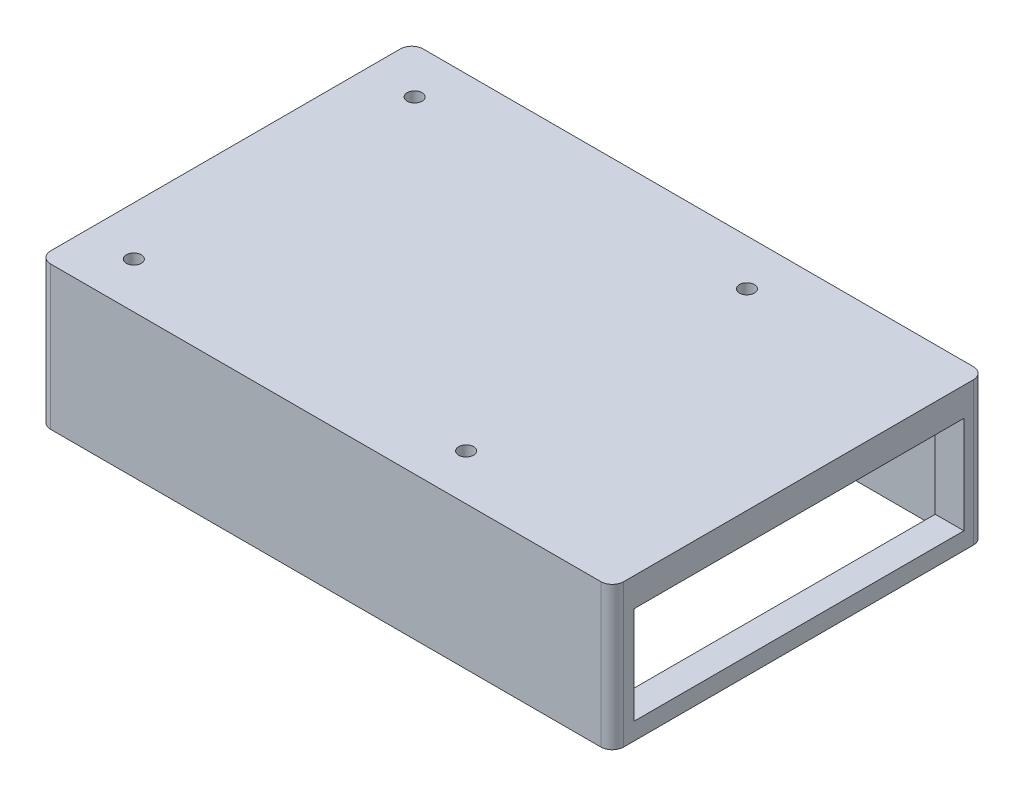
ISO-10303-21;
HEADER;
FILE_DESCRIPTION(('STEP AP214'),'2;1');
FILE_NAME('part.step','',(''),(''),'','','');
FILE_SCHEMA(('AUTOMOTIVE_DESIGN { 1 0 10303 214 1 1 1 1 }'));
ENDSEC;
DATA;
#1=APPLICATION_CONTEXT('core data for automotive mechanical design processes');
#2=APPLICATION_PROTOCOL_DEFINITION('international standard','automotive_design',2000,#1);
#3=PRODUCT_CONTEXT('',#1,'mechanical');
#4=PRODUCT('Part','Part','',(#3));
#5=PRODUCT_RELATED_PRODUCT_CATEGORY('part','',(#4));
#6=PRODUCT_DEFINITION_FORMATION('','',#4);
#7=PRODUCT_DEFINITION_CONTEXT('part definition',#1,'design');
#8=PRODUCT_DEFINITION('design','',#6,#7);
#9=PRODUCT_DEFINITION_SHAPE('','',#8);
#10=(LENGTH_UNIT() NAMED_UNIT(*) SI_UNIT(.MILLI.,.METRE.));
#11=(NAMED_UNIT(*) PLANE_ANGLE_UNIT() SI_UNIT($,.RADIAN.));
#12=(NAMED_UNIT(*) SI_UNIT($,.STERADIAN.) SOLID_ANGLE_UNIT());
#13=UNCERTAINTY_MEASURE_WITH_UNIT(LENGTH_MEASURE(1.E-05),#10,'distance_accuracy_value','');
#14=(GEOMETRIC_REPRESENTATION_CONTEXT(3) GLOBAL_UNCERTAINTY_ASSIGNED_CONTEXT((#13)) GLOBAL_UNIT_ASSIGNED_CONTEXT((#10,
#11,#12)) REPRESENTATION_CONTEXT('',''));
#15=CARTESIAN_POINT('',(0.,0.,0.));
#16=DIRECTION('',(0.,0.,1.));
#17=DIRECTION('',(1.,0.,0.));
#18=AXIS2_PLACEMENT_3D('',#15,#16,#17);
#19=CARTESIAN_POINT('',(48.,25.,-30.5));
#20=DIRECTION('',(0.,1.,0.));
#21=DIRECTION('',(0.,0.,1.));
#22=AXIS2_PLACEMENT_3D('',#19,#20,#21);
#23=CYLINDRICAL_SURFACE('',#22,2.);
#24=DIRECTION('',(0.,1.,0.));
#25=VECTOR('',#24,1.);
#26=CARTESIAN_POINT('',(50.,25.,-30.5));
#27=LINE('',#26,#25);
#28=CARTESIAN_POINT('',(50.,0.,-30.5));
#29=VERTEX_POINT('',#28);
#30=CARTESIAN_POINT('',(50.,25.,-30.5));
#31=VERTEX_POINT('',#30);
#32=EDGE_CURVE('E339',#29,#31,#27,.T.);
#33=ORIENTED_EDGE('',*,*,#32,.F.);
#34=CARTESIAN_POINT('',(48.,0.,-30.5));
#35=DIRECTION('',(0.,1.,0.));
#36=DIRECTION('',(0.,0.,1.));
#37=AXIS2_PLACEMENT_3D('',#34,#35,#36);
#38=CIRCLE('',#37,2.);
#39=CARTESIAN_POINT('',(48.,0.,-32.5));
#40=VERTEX_POINT('',#39);
#41=EDGE_CURVE('E345',#40,#29,#38,.F.);
#42=ORIENTED_EDGE('',*,*,#41,.F.);
#43=DIRECTION('',(0.,1.,0.));
#44=VECTOR('',#43,1.);
#45=CARTESIAN_POINT('',(48.,25.,-32.5));
#46=LINE('',#45,#44);
#47=CARTESIAN_POINT('',(48.,25.,-32.5));
#48=VERTEX_POINT('',#47);
#49=EDGE_CURVE('E342',#48,#40,#46,.F.);
#50=ORIENTED_EDGE('',*,*,#49,.F.);
#51=CARTESIAN_POINT('',(48.,25.,-30.5));
#52=DIRECTION('',(0.,1.,0.));
#53=DIRECTION('',(0.,0.,1.));
#54=AXIS2_PLACEMENT_3D('',#51,#52,#53);
#55=CIRCLE('',#54,2.);
#56=EDGE_CURVE('E347',#31,#48,#55,.T.);
#57=ORIENTED_EDGE('',*,*,#56,.F.);
#58=EDGE_LOOP('',(#33,#42,#50,#57));
#59=FACE_BOUND('',#58,.T.);
#60=ADVANCED_FACE('F40',(#59),#23,.T.);
#61=CARTESIAN_POINT('',(-48.,25.,-30.5));
#62=DIRECTION('',(0.,-1.,0.));
#63=DIRECTION('',(0.,0.,-1.));
#64=AXIS2_PLACEMENT_3D('',#61,#62,#63);
#65=CYLINDRICAL_SURFACE('',#64,2.);
#66=DIRECTION('',(0.,1.,0.));
#67=VECTOR('',#66,1.);
#68=CARTESIAN_POINT('',(-48.,25.,-32.5));
#69=LINE('',#68,#67);
#70=CARTESIAN_POINT('',(-48.,0.,-32.5));
#71=VERTEX_POINT('',#70);
#72=CARTESIAN_POINT('',(-48.,25.,-32.5));
#73=VERTEX_POINT('',#72);
#74=EDGE_CURVE('E329',#71,#73,#69,.T.);
#75=ORIENTED_EDGE('',*,*,#74,.F.);
#76=CARTESIAN_POINT('',(-48.,0.,-30.5));
#77=DIRECTION('',(0.,1.,0.));
#78=DIRECTION('',(0.,0.,1.));
#79=AXIS2_PLACEMENT_3D('',#76,#77,#78);
#80=CIRCLE('',#79,2.);
#81=CARTESIAN_POINT('',(-50.,0.,-30.5));
#82=VERTEX_POINT('',#81);
#83=EDGE_CURVE('E335',#82,#71,#80,.F.);
#84=ORIENTED_EDGE('',*,*,#83,.F.);
#85=DIRECTION('',(0.,1.,0.));
#86=VECTOR('',#85,1.);
#87=CARTESIAN_POINT('',(-50.,25.,-30.5));
#88=LINE('',#87,#86);
#89=CARTESIAN_POINT('',(-50.,25.,-30.5));
#90=VERTEX_POINT('',#89);
#91=EDGE_CURVE('E332',#90,#82,#88,.F.);
#92=ORIENTED_EDGE('',*,*,#91,.F.);
#93=CARTESIAN_POINT('',(-48.,25.,-30.5));
#94=DIRECTION('',(0.,1.,0.));
#95=DIRECTION('',(0.,0.,1.));
#96=AXIS2_PLACEMENT_3D('',#93,#94,#95);
#97=CIRCLE('',#96,2.);
#98=EDGE_CURVE('E337',#73,#90,#97,.T.);
#99=ORIENTED_EDGE('',*,*,#98,.F.);
#100=EDGE_LOOP('',(#75,#84,#92,#99));
#101=FACE_BOUND('',#100,.T.);
#102=ADVANCED_FACE('F376',(#101),#65,.T.);
#103=CARTESIAN_POINT('',(-48.,25.,30.5));
#104=DIRECTION('',(0.,1.,0.));
#105=DIRECTION('',(0.,0.,1.));
#106=AXIS2_PLACEMENT_3D('',#103,#104,#105);
#107=CYLINDRICAL_SURFACE('',#106,2.);
#108=DIRECTION('',(0.,1.,0.));
#109=VECTOR('',#108,1.);
#110=CARTESIAN_POINT('',(-50.,25.,30.5));
#111=LINE('',#110,#109);
#112=CARTESIAN_POINT('',(-50.,0.,30.5));
#113=VERTEX_POINT('',#112);
#114=CARTESIAN_POINT('',(-50.,25.,30.5));
#115=VERTEX_POINT('',#114);
#116=EDGE_CURVE('E318',#113,#115,#111,.T.);
#117=ORIENTED_EDGE('',*,*,#116,.F.);
#118=CARTESIAN_POINT('',(-48.,0.,30.5));
#119=DIRECTION('',(0.,1.,0.));
#120=DIRECTION('',(0.,0.,1.));
#121=AXIS2_PLACEMENT_3D('',#118,#119,#120);
#122=CIRCLE('',#121,2.);
#123=CARTESIAN_POINT('',(-48.,0.,32.5));
#124=VERTEX_POINT('',#123);
#125=EDGE_CURVE('E324',#124,#113,#122,.F.);
#126=ORIENTED_EDGE('',*,*,#125,.F.);
#127=DIRECTION('',(0.,1.,0.));
#128=VECTOR('',#127,1.);
#129=CARTESIAN_POINT('',(-48.,25.,32.5));
#130=LINE('',#129,#128);
#131=CARTESIAN_POINT('',(-48.,25.,32.5));
#132=VERTEX_POINT('',#131);
#133=EDGE_CURVE('E321',#132,#124,#130,.F.);
#134=ORIENTED_EDGE('',*,*,#133,.F.);
#135=CARTESIAN_POINT('',(-48.,25.,30.5));
#136=DIRECTION('',(0.,1.,0.));
#137=DIRECTION('',(0.,0.,1.));
#138=AXIS2_PLACEMENT_3D('',#135,#136,#137);
#139=CIRCLE('',#138,2.);
#140=EDGE_CURVE('E327',#115,#132,#139,.T.);
#141=ORIENTED_EDGE('',*,*,#140,.F.);
#142=EDGE_LOOP('',(#117,#126,#134,#141));
#143=FACE_BOUND('',#142,.T.);
#144=ADVANCED_FACE('F381',(#143),#107,.T.);
#145=CARTESIAN_POINT('',(48.,25.,30.5));
#146=DIRECTION('',(0.,-1.,0.));
#147=DIRECTION('',(0.,0.,-1.));
#148=AXIS2_PLACEMENT_3D('',#145,#146,#147);
#149=CYLINDRICAL_SURFACE('',#148,2.);
#150=DIRECTION('',(0.,1.,0.));
#151=VECTOR('',#150,1.);
#152=CARTESIAN_POINT('',(48.,25.,32.5));
#153=LINE('',#152,#151);
#154=CARTESIAN_POINT('',(48.,0.,32.5));
#155=VERTEX_POINT('',#154);
#156=CARTESIAN_POINT('',(48.,25.,32.5));
#157=VERTEX_POINT('',#156);
#158=EDGE_CURVE('E299',#155,#157,#153,.T.);
#159=ORIENTED_EDGE('',*,*,#158,.F.);
#160=CARTESIAN_POINT('',(48.,0.,30.5));
#161=DIRECTION('',(0.,1.,0.));
#162=DIRECTION('',(0.,0.,1.));
#163=AXIS2_PLACEMENT_3D('',#160,#161,#162);
#164=CIRCLE('',#163,2.);
#165=CARTESIAN_POINT('',(50.,0.,30.5));
#166=VERTEX_POINT('',#165);
#167=EDGE_CURVE('E312',#166,#155,#164,.F.);
#168=ORIENTED_EDGE('',*,*,#167,.F.);
#169=DIRECTION('',(0.,1.,0.));
#170=VECTOR('',#169,1.);
#171=CARTESIAN_POINT('',(50.,25.,30.5));
#172=LINE('',#171,#170);
#173=CARTESIAN_POINT('',(50.,25.,30.5));
#174=VERTEX_POINT('',#173);
#175=EDGE_CURVE('E309',#174,#166,#172,.F.);
#176=ORIENTED_EDGE('',*,*,#175,.F.);
#177=CARTESIAN_POINT('',(48.,25.,30.5));
#178=DIRECTION('',(0.,1.,0.));
#179=DIRECTION('',(0.,0.,1.));
#180=AXIS2_PLACEMENT_3D('',#177,#178,#179);
#181=CIRCLE('',#180,2.);
#182=EDGE_CURVE('E315',#157,#174,#181,.T.);
#183=ORIENTED_EDGE('',*,*,#182,.F.);
#184=EDGE_LOOP('',(#159,#168,#176,#183));
#185=FACE_BOUND('',#184,.T.);
#186=ADVANCED_FACE('F395',(#185),#149,.T.);
#187=CARTESIAN_POINT('',(0.,0.,0.));
#188=DIRECTION('',(0.,1.,0.));
#189=DIRECTION('',(0.,0.,1.));
#190=AXIS2_PLACEMENT_3D('',#187,#188,#189);
#191=PLANE('',#190);
#192=DIRECTION('',(1.,0.,0.));
#193=VECTOR('',#192,1.);
#194=CARTESIAN_POINT('',(-50.,0.,-32.5));
#195=LINE('',#194,#193);
#196=EDGE_CURVE('E292',#71,#40,#195,.T.);
#197=ORIENTED_EDGE('',*,*,#196,.T.);
#198=ORIENTED_EDGE('',*,*,#41,.T.);
#199=DIRECTION('',(0.,0.,1.));
#200=VECTOR('',#199,1.);
#201=CARTESIAN_POINT('',(50.,0.,-32.5));
#202=LINE('',#201,#200);
#203=EDGE_CURVE('E303',#29,#166,#202,.T.);
#204=ORIENTED_EDGE('',*,*,#203,.T.);
#205=ORIENTED_EDGE('',*,*,#167,.T.);
#206=DIRECTION('',(1.,0.,0.));
#207=VECTOR('',#206,1.);
#208=CARTESIAN_POINT('',(-50.,0.,32.5));
#209=LINE('',#208,#207);
#210=EDGE_CURVE('E301',#124,#155,#209,.T.);
#211=ORIENTED_EDGE('',*,*,#210,.F.);
#212=ORIENTED_EDGE('',*,*,#125,.T.);
#213=DIRECTION('',(0.,0.,1.));
#214=VECTOR('',#213,1.);
#215=CARTESIAN_POINT('',(-50.,0.,-32.5));
#216=LINE('',#215,#214);
#217=EDGE_CURVE('E288',#82,#113,#216,.T.);
#218=ORIENTED_EDGE('',*,*,#217,.F.);
#219=ORIENTED_EDGE('',*,*,#83,.T.);
#220=EDGE_LOOP('',(#197,#198,#204,#205,#211,#212,#218,#219));
#221=FACE_BOUND('',#220,.T.);
#222=DIRECTION('',(1.,0.,0.));
#223=VECTOR('',#222,1.);
#224=CARTESIAN_POINT('',(-45.,0.,30.));
#225=LINE('',#224,#223);
#226=CARTESIAN_POINT('',(-45.,0.,30.));
#227=VERTEX_POINT('',#226);
#228=CARTESIAN_POINT('',(45.,0.,30.));
#229=VERTEX_POINT('',#228);
#230=EDGE_CURVE('E253',#227,#229,#225,.T.);
#231=ORIENTED_EDGE('',*,*,#230,.T.);
#232=DIRECTION('',(0.,0.,-1.));
#233=VECTOR('',#232,1.);
#234=CARTESIAN_POINT('',(45.,0.,30.));
#235=LINE('',#234,#233);
#236=CARTESIAN_POINT('',(45.,0.,-30.));
#237=VERTEX_POINT('',#236);
#238=EDGE_CURVE('E271',#229,#237,#235,.T.);
#239=ORIENTED_EDGE('',*,*,#238,.T.);
#240=DIRECTION('',(1.,0.,0.));
#241=VECTOR('',#240,1.);
#242=CARTESIAN_POINT('',(-45.,0.,-30.));
#243=LINE('',#242,#241);
#244=CARTESIAN_POINT('',(-45.,0.,-30.));
#245=VERTEX_POINT('',#244);
#246=EDGE_CURVE('E274',#245,#237,#243,.T.);
#247=ORIENTED_EDGE('',*,*,#246,.F.);
#248=DIRECTION('',(0.,0.,-1.));
#249=VECTOR('',#248,1.);
#250=CARTESIAN_POINT('',(-45.,0.,30.));
#251=LINE('',#250,#249);
#252=EDGE_CURVE('E258',#227,#245,#251,.T.);
#253=ORIENTED_EDGE('',*,*,#252,.F.);
#254=EDGE_LOOP('',(#231,#239,#247,#253));
#255=FACE_BOUND('',#254,.T.);
#256=ADVANCED_FACE('F390',(#221,#255),#191,.F.);
#257=CARTESIAN_POINT('',(-50.,25.,-32.5));
#258=DIRECTION('',(1.,0.,0.));
#259=DIRECTION('',(0.,0.,-1.));
#260=AXIS2_PLACEMENT_3D('',#257,#258,#259);
#261=PLANE('',#260);
#262=DIRECTION('',(0.,0.,1.));
#263=VECTOR('',#262,1.);
#264=CARTESIAN_POINT('',(-50.,25.,-32.5));
#265=LINE('',#264,#263);
#266=EDGE_CURVE('E289',#90,#115,#265,.T.);
#267=ORIENTED_EDGE('',*,*,#266,.F.);
#268=ORIENTED_EDGE('',*,*,#91,.T.);
#269=ORIENTED_EDGE('',*,*,#217,.T.);
#270=ORIENTED_EDGE('',*,*,#116,.T.);
#271=EDGE_LOOP('',(#267,#268,#269,#270));
#272=FACE_BOUND('',#271,.T.);
#273=ADVANCED_FACE('F407',(#272),#261,.F.);
#274=CARTESIAN_POINT('',(-50.,25.,32.5));
#275=DIRECTION('',(0.,0.,-1.));
#276=DIRECTION('',(-1.,0.,0.));
#277=AXIS2_PLACEMENT_3D('',#274,#275,#276);
#278=PLANE('',#277);
#279=DIRECTION('',(1.,0.,0.));
#280=VECTOR('',#279,1.);
#281=CARTESIAN_POINT('',(-50.,25.,32.5));
#282=LINE('',#281,#280);
#283=EDGE_CURVE('E291',#132,#157,#282,.T.);
#284=ORIENTED_EDGE('',*,*,#283,.F.);
#285=ORIENTED_EDGE('',*,*,#133,.T.);
#286=ORIENTED_EDGE('',*,*,#210,.T.);
#287=ORIENTED_EDGE('',*,*,#158,.T.);
#288=EDGE_LOOP('',(#284,#285,#286,#287));
#289=FACE_BOUND('',#288,.T.);
#290=ADVANCED_FACE('F399',(#289),#278,.F.);
#291=CARTESIAN_POINT('',(50.,25.,-32.5));
#292=DIRECTION('',(1.,0.,0.));
#293=DIRECTION('',(0.,0.,-1.));
#294=AXIS2_PLACEMENT_3D('',#291,#292,#293);
#295=PLANE('',#294);
#296=DIRECTION('',(0.,-1.,0.));
#297=VECTOR('',#296,1.);
#298=CARTESIAN_POINT('',(50.,20.,28.7137423599596));
#299=LINE('',#298,#297);
#300=CARTESIAN_POINT('',(50.,20.,28.7137423599596));
#301=VERTEX_POINT('',#300);
#302=CARTESIAN_POINT('',(50.,3.,28.7137423599596));
#303=VERTEX_POINT('',#302);
#304=EDGE_CURVE('E54',#301,#303,#299,.T.);
#305=ORIENTED_EDGE('',*,*,#304,.F.);
#306=DIRECTION('',(0.,0.,1.));
#307=VECTOR('',#306,1.);
#308=CARTESIAN_POINT('',(50.,20.,28.7137423599596));
#309=LINE('',#308,#307);
#310=CARTESIAN_POINT('',(50.,20.,-28.8609923207799));
#311=VERTEX_POINT('',#310);
#312=EDGE_CURVE('E194',#311,#301,#309,.T.);
#313=ORIENTED_EDGE('',*,*,#312,.F.);
#314=DIRECTION('',(0.,1.,0.));
#315=VECTOR('',#314,1.);
#316=CARTESIAN_POINT('',(50.,20.,-28.8609923207799));
#317=LINE('',#316,#315);
#318=CARTESIAN_POINT('',(50.,3.,-28.8609923207799));
#319=VERTEX_POINT('',#318);
#320=EDGE_CURVE('E178',#319,#311,#317,.T.);
#321=ORIENTED_EDGE('',*,*,#320,.F.);
#322=DIRECTION('',(0.,0.,-1.));
#323=VECTOR('',#322,1.);
#324=CARTESIAN_POINT('',(50.,3.,28.7137423599596));
#325=LINE('',#324,#323);
#326=EDGE_CURVE('E187',#303,#319,#325,.T.);
#327=ORIENTED_EDGE('',*,*,#326,.F.);
#328=EDGE_LOOP('',(#305,#313,#321,#327));
#329=FACE_BOUND('',#328,.T.);
#330=ORIENTED_EDGE('',*,*,#203,.F.);
#331=ORIENTED_EDGE('',*,*,#32,.T.);
#332=DIRECTION('',(0.,0.,1.));
#333=VECTOR('',#332,1.);
#334=CARTESIAN_POINT('',(50.,25.,-32.5));
#335=LINE('',#334,#333);
#336=EDGE_CURVE('E294',#31,#174,#335,.T.);
#337=ORIENTED_EDGE('',*,*,#336,.T.);
#338=ORIENTED_EDGE('',*,*,#175,.T.);
#339=EDGE_LOOP('',(#330,#331,#337,#338));
#340=FACE_BOUND('',#339,.T.);
#341=ADVANCED_FACE('F191',(#329,#340),#295,.T.);
#342=CARTESIAN_POINT('',(-50.,25.,-32.5));
#343=DIRECTION('',(0.,0.,-1.));
#344=DIRECTION('',(-1.,0.,0.));
#345=AXIS2_PLACEMENT_3D('',#342,#343,#344);
#346=PLANE('',#345);
#347=DIRECTION('',(0.,-1.,0.));
#348=VECTOR('',#347,1.);
#349=CARTESIAN_POINT('',(-2.00000000000002,22.,-32.5));
#350=LINE('',#349,#348);
#351=CARTESIAN_POINT('',(-2.00000000000002,22.,-32.5));
#352=VERTEX_POINT('',#351);
#353=CARTESIAN_POINT('',(-2.00000000000002,15.2793607625604,-32.5));
#354=VERTEX_POINT('',#353);
#355=EDGE_CURVE('E201',#352,#354,#350,.T.);
#356=ORIENTED_EDGE('',*,*,#355,.F.);
#357=DIRECTION('',(1.,0.,0.));
#358=VECTOR('',#357,1.);
#359=CARTESIAN_POINT('',(-2.00000000000002,22.,-32.5));
#360=LINE('',#359,#358);
#361=CARTESIAN_POINT('',(-39.,22.,-32.5));
#362=VERTEX_POINT('',#361);
#363=EDGE_CURVE('E211',#362,#352,#360,.T.);
#364=ORIENTED_EDGE('',*,*,#363,.F.);
#365=DIRECTION('',(0.,1.,0.));
#366=VECTOR('',#365,1.);
#367=CARTESIAN_POINT('',(-39.,22.,-32.5));
#368=LINE('',#367,#366);
#369=CARTESIAN_POINT('',(-39.,15.2793607625604,-32.5));
#370=VERTEX_POINT('',#369);
#371=EDGE_CURVE('E208',#370,#362,#368,.T.);
#372=ORIENTED_EDGE('',*,*,#371,.F.);
#373=DIRECTION('',(-1.,0.,0.));
#374=VECTOR('',#373,1.);
#375=CARTESIAN_POINT('',(-2.00000000000002,15.2793607625604,-32.5));
#376=LINE('',#375,#374);
#377=EDGE_CURVE('E205',#354,#370,#376,.T.);
#378=ORIENTED_EDGE('',*,*,#377,.F.);
#379=EDGE_LOOP('',(#356,#364,#372,#378));
#380=FACE_BOUND('',#379,.T.);
#381=DIRECTION('',(1.,0.,0.));
#382=VECTOR('',#381,1.);
#383=CARTESIAN_POINT('',(-50.,25.,-32.5));
#384=LINE('',#383,#382);
#385=EDGE_CURVE('E296',#73,#48,#384,.T.);
#386=ORIENTED_EDGE('',*,*,#385,.T.);
#387=ORIENTED_EDGE('',*,*,#49,.T.);
#388=ORIENTED_EDGE('',*,*,#196,.F.);
#389=ORIENTED_EDGE('',*,*,#74,.T.);
#390=EDGE_LOOP('',(#386,#387,#388,#389));
#391=FACE_BOUND('',#390,.T.);
#392=ADVANCED_FACE('F412',(#380,#391),#346,.T.);
#393=CARTESIAN_POINT('',(0.,25.,0.));
#394=DIRECTION('',(0.,1.,0.));
#395=DIRECTION('',(0.,0.,1.));
#396=AXIS2_PLACEMENT_3D('',#393,#394,#395);
#397=PLANE('',#396);
#398=CARTESIAN_POINT('',(16.5,25.,24.5));
#399=DIRECTION('',(0.,1.,0.));
#400=DIRECTION('',(0.,0.,1.));
#401=AXIS2_PLACEMENT_3D('',#398,#399,#400);
#402=CIRCLE('',#401,1.3);
#403=CARTESIAN_POINT('',(16.5,25.,25.8));
#404=VERTEX_POINT('',#403);
#405=EDGE_CURVE('E250',#404,#404,#402,.T.);
#406=ORIENTED_EDGE('',*,*,#405,.F.);
#407=EDGE_LOOP('',(#406));
#408=FACE_BOUND('',#407,.T.);
#409=CARTESIAN_POINT('',(16.5,25.,-24.5));
#410=DIRECTION('',(0.,1.,0.));
#411=DIRECTION('',(0.,0.,1.));
#412=AXIS2_PLACEMENT_3D('',#409,#410,#411);
#413=CIRCLE('',#412,1.3);
#414=CARTESIAN_POINT('',(16.5,25.,-23.2));
#415=VERTEX_POINT('',#414);
#416=EDGE_CURVE('E247',#415,#415,#413,.T.);
#417=ORIENTED_EDGE('',*,*,#416,.F.);
#418=EDGE_LOOP('',(#417));
#419=FACE_BOUND('',#418,.T.);
#420=CARTESIAN_POINT('',(-41.5,25.,-24.5));
#421=DIRECTION('',(0.,1.,0.));
#422=DIRECTION('',(0.,0.,1.));
#423=AXIS2_PLACEMENT_3D('',#420,#421,#422);
#424=CIRCLE('',#423,1.3);
#425=CARTESIAN_POINT('',(-41.5,25.,-23.2));
#426=VERTEX_POINT('',#425);
#427=EDGE_CURVE('E244',#426,#426,#424,.T.);
#428=ORIENTED_EDGE('',*,*,#427,.F.);
#429=EDGE_LOOP('',(#428));
#430=FACE_BOUND('',#429,.T.);
#431=CARTESIAN_POINT('',(-41.5,25.,24.5));
#432=DIRECTION('',(0.,1.,0.));
#433=DIRECTION('',(0.,0.,1.));
#434=AXIS2_PLACEMENT_3D('',#431,#432,#433);
#435=CIRCLE('',#434,1.3);
#436=CARTESIAN_POINT('',(-41.5,25.,25.8));
#437=VERTEX_POINT('',#436);
#438=EDGE_CURVE('E241',#437,#437,#435,.T.);
#439=ORIENTED_EDGE('',*,*,#438,.F.);
#440=EDGE_LOOP('',(#439));
#441=FACE_BOUND('',#440,.T.);
#442=ORIENTED_EDGE('',*,*,#336,.F.);
#443=ORIENTED_EDGE('',*,*,#56,.T.);
#444=ORIENTED_EDGE('',*,*,#385,.F.);
#445=ORIENTED_EDGE('',*,*,#98,.T.);
#446=ORIENTED_EDGE('',*,*,#266,.T.);
#447=ORIENTED_EDGE('',*,*,#140,.T.);
#448=ORIENTED_EDGE('',*,*,#283,.T.);
#449=ORIENTED_EDGE('',*,*,#182,.T.);
#450=EDGE_LOOP('',(#442,#443,#444,#445,#446,#447,#448,#449));
#451=FACE_BOUND('',#450,.T.);
#452=ADVANCED_FACE('F415',(#408,#419,#430,#441,#451),#397,.T.);
#453=CARTESIAN_POINT('',(-45.,22.,30.));
#454=DIRECTION('',(0.,0.,-1.));
#455=DIRECTION('',(-1.,0.,0.));
#456=AXIS2_PLACEMENT_3D('',#453,#454,#455);
#457=PLANE('',#456);
#458=ORIENTED_EDGE('',*,*,#230,.F.);
#459=DIRECTION('',(0.,-1.,0.));
#460=VECTOR('',#459,1.);
#461=CARTESIAN_POINT('',(-45.,22.,30.));
#462=LINE('',#461,#460);
#463=CARTESIAN_POINT('',(-45.,22.,30.));
#464=VERTEX_POINT('',#463);
#465=EDGE_CURVE('E268',#464,#227,#462,.T.);
#466=ORIENTED_EDGE('',*,*,#465,.F.);
#467=DIRECTION('',(1.,0.,0.));
#468=VECTOR('',#467,1.);
#469=CARTESIAN_POINT('',(-45.,22.,30.));
#470=LINE('',#469,#468);
#471=CARTESIAN_POINT('',(45.,22.,30.));
#472=VERTEX_POINT('',#471);
#473=EDGE_CURVE('E254',#464,#472,#470,.T.);
#474=ORIENTED_EDGE('',*,*,#473,.T.);
#475=DIRECTION('',(0.,-1.,0.));
#476=VECTOR('',#475,1.);
#477=CARTESIAN_POINT('',(45.,22.,30.));
#478=LINE('',#477,#476);
#479=EDGE_CURVE('E285',#472,#229,#478,.T.);
#480=ORIENTED_EDGE('',*,*,#479,.T.);
#481=EDGE_LOOP('',(#458,#466,#474,#480));
#482=FACE_BOUND('',#481,.T.);
#483=ADVANCED_FACE('F417',(#482),#457,.T.);
#484=CARTESIAN_POINT('',(45.,22.,30.));
#485=DIRECTION('',(-1.,0.,0.));
#486=DIRECTION('',(0.,0.,1.));
#487=AXIS2_PLACEMENT_3D('',#484,#485,#486);
#488=PLANE('',#487);
#489=DIRECTION('',(0.,1.,0.));
#490=VECTOR('',#489,1.);
#491=CARTESIAN_POINT('',(45.,22.,28.7137423599596));
#492=LINE('',#491,#490);
#493=CARTESIAN_POINT('',(45.,3.,28.7137423599596));
#494=VERTEX_POINT('',#493);
#495=CARTESIAN_POINT('',(45.,20.,28.7137423599596));
#496=VERTEX_POINT('',#495);
#497=EDGE_CURVE('E11',#494,#496,#492,.T.);
#498=ORIENTED_EDGE('',*,*,#497,.F.);
#499=DIRECTION('',(0.,0.,1.));
#500=VECTOR('',#499,1.);
#501=CARTESIAN_POINT('',(45.,3.,30.));
#502=LINE('',#501,#500);
#503=CARTESIAN_POINT('',(45.,3.,-28.8609923207799));
#504=VERTEX_POINT('',#503);
#505=EDGE_CURVE('E352',#504,#494,#502,.T.);
#506=ORIENTED_EDGE('',*,*,#505,.F.);
#507=DIRECTION('',(0.,-1.,0.));
#508=VECTOR('',#507,1.);
#509=CARTESIAN_POINT('',(45.,22.,-28.8609923207799));
#510=LINE('',#509,#508);
#511=CARTESIAN_POINT('',(45.,20.,-28.8609923207799));
#512=VERTEX_POINT('',#511);
#513=EDGE_CURVE('E181',#512,#504,#510,.T.);
#514=ORIENTED_EDGE('',*,*,#513,.F.);
#515=DIRECTION('',(0.,0.,-1.));
#516=VECTOR('',#515,1.);
#517=CARTESIAN_POINT('',(45.,20.,30.));
#518=LINE('',#517,#516);
#519=EDGE_CURVE('E47',#496,#512,#518,.T.);
#520=ORIENTED_EDGE('',*,*,#519,.F.);
#521=EDGE_LOOP('',(#498,#506,#514,#520));
#522=FACE_BOUND('',#521,.T.);
#523=ORIENTED_EDGE('',*,*,#238,.F.);
#524=ORIENTED_EDGE('',*,*,#479,.F.);
#525=DIRECTION('',(0.,0.,-1.));
#526=VECTOR('',#525,1.);
#527=CARTESIAN_POINT('',(45.,22.,30.));
#528=LINE('',#527,#526);
#529=CARTESIAN_POINT('',(45.,22.,-30.));
#530=VERTEX_POINT('',#529);
#531=EDGE_CURVE('E257',#472,#530,#528,.T.);
#532=ORIENTED_EDGE('',*,*,#531,.T.);
#533=DIRECTION('',(0.,-1.,0.));
#534=VECTOR('',#533,1.);
#535=CARTESIAN_POINT('',(45.,22.,-30.));
#536=LINE('',#535,#534);
#537=EDGE_CURVE('E283',#530,#237,#536,.T.);
#538=ORIENTED_EDGE('',*,*,#537,.T.);
#539=EDGE_LOOP('',(#523,#524,#532,#538));
#540=FACE_BOUND('',#539,.T.);
#541=ADVANCED_FACE('F360',(#522,#540),#488,.T.);
#542=CARTESIAN_POINT('',(-45.,22.,-30.));
#543=DIRECTION('',(0.,0.,-1.));
#544=DIRECTION('',(-1.,0.,0.));
#545=AXIS2_PLACEMENT_3D('',#542,#543,#544);
#546=PLANE('',#545);
#547=DIRECTION('',(1.,0.,0.));
#548=VECTOR('',#547,1.);
#549=CARTESIAN_POINT('',(-45.,22.,-30.));
#550=LINE('',#549,#548);
#551=CARTESIAN_POINT('',(-2.00000000000002,22.,-30.));
#552=VERTEX_POINT('',#551);
#553=EDGE_CURVE('E261',#552,#530,#550,.T.);
#554=ORIENTED_EDGE('',*,*,#553,.F.);
#555=DIRECTION('',(0.,-1.,0.));
#556=VECTOR('',#555,1.);
#557=CARTESIAN_POINT('',(-2.00000000000002,22.,-30.));
#558=LINE('',#557,#556);
#559=CARTESIAN_POINT('',(-2.00000000000002,15.2793607625604,-30.));
#560=VERTEX_POINT('',#559);
#561=EDGE_CURVE('E226',#552,#560,#558,.T.);
#562=ORIENTED_EDGE('',*,*,#561,.T.);
#563=DIRECTION('',(-1.,0.,0.));
#564=VECTOR('',#563,1.);
#565=CARTESIAN_POINT('',(-45.,15.2793607625604,-30.));
#566=LINE('',#565,#564);
#567=CARTESIAN_POINT('',(-39.,15.2793607625604,-30.));
#568=VERTEX_POINT('',#567);
#569=EDGE_CURVE('E349',#560,#568,#566,.T.);
#570=ORIENTED_EDGE('',*,*,#569,.T.);
#571=DIRECTION('',(0.,1.,0.));
#572=VECTOR('',#571,1.);
#573=CARTESIAN_POINT('',(-39.,22.,-30.));
#574=LINE('',#573,#572);
#575=CARTESIAN_POINT('',(-39.,22.,-30.));
#576=VERTEX_POINT('',#575);
#577=EDGE_CURVE('E217',#568,#576,#574,.T.);
#578=ORIENTED_EDGE('',*,*,#577,.T.);
#579=CARTESIAN_POINT('',(-45.,22.,-30.));
#580=VERTEX_POINT('',#579);
#581=EDGE_CURVE('E262',#580,#576,#550,.T.);
#582=ORIENTED_EDGE('',*,*,#581,.F.);
#583=DIRECTION('',(0.,-1.,0.));
#584=VECTOR('',#583,1.);
#585=CARTESIAN_POINT('',(-45.,22.,-30.));
#586=LINE('',#585,#584);
#587=EDGE_CURVE('E281',#580,#245,#586,.T.);
#588=ORIENTED_EDGE('',*,*,#587,.T.);
#589=ORIENTED_EDGE('',*,*,#246,.T.);
#590=ORIENTED_EDGE('',*,*,#537,.F.);
#591=EDGE_LOOP('',(#554,#562,#570,#578,#582,#588,#589,#590));
#592=FACE_BOUND('',#591,.T.);
#593=ADVANCED_FACE('F482',(#592),#546,.F.);
#594=CARTESIAN_POINT('',(-45.,22.,30.));
#595=DIRECTION('',(-1.,0.,0.));
#596=DIRECTION('',(0.,0.,1.));
#597=AXIS2_PLACEMENT_3D('',#594,#595,#596);
#598=PLANE('',#597);
#599=ORIENTED_EDGE('',*,*,#252,.T.);
#600=ORIENTED_EDGE('',*,*,#587,.F.);
#601=DIRECTION('',(0.,0.,-1.));
#602=VECTOR('',#601,1.);
#603=CARTESIAN_POINT('',(-45.,22.,30.));
#604=LINE('',#603,#602);
#605=EDGE_CURVE('E265',#464,#580,#604,.T.);
#606=ORIENTED_EDGE('',*,*,#605,.F.);
#607=ORIENTED_EDGE('',*,*,#465,.T.);
#608=EDGE_LOOP('',(#599,#600,#606,#607));
#609=FACE_BOUND('',#608,.T.);
#610=ADVANCED_FACE('F487',(#609),#598,.F.);
#611=CARTESIAN_POINT('',(0.,22.,0.));
#612=DIRECTION('',(0.,1.,0.));
#613=DIRECTION('',(0.,0.,1.));
#614=AXIS2_PLACEMENT_3D('',#611,#612,#613);
#615=PLANE('',#614);
#616=ORIENTED_EDGE('',*,*,#581,.T.);
#617=DIRECTION('',(0.,0.,-1.));
#618=VECTOR('',#617,1.);
#619=CARTESIAN_POINT('',(-39.,22.,-22.5));
#620=LINE('',#619,#618);
#621=EDGE_CURVE('E218',#576,#362,#620,.T.);
#622=ORIENTED_EDGE('',*,*,#621,.T.);
#623=ORIENTED_EDGE('',*,*,#363,.T.);
#624=DIRECTION('',(0.,0.,-1.));
#625=VECTOR('',#624,1.);
#626=CARTESIAN_POINT('',(-2.00000000000002,22.,-22.5));
#627=LINE('',#626,#625);
#628=EDGE_CURVE('E215',#552,#352,#627,.T.);
#629=ORIENTED_EDGE('',*,*,#628,.F.);
#630=ORIENTED_EDGE('',*,*,#553,.T.);
#631=ORIENTED_EDGE('',*,*,#531,.F.);
#632=ORIENTED_EDGE('',*,*,#473,.F.);
#633=ORIENTED_EDGE('',*,*,#605,.T.);
#634=EDGE_LOOP('',(#616,#622,#623,#629,#630,#631,#632,#633));
#635=FACE_BOUND('',#634,.T.);
#636=CARTESIAN_POINT('',(16.5,22.,24.5));
#637=DIRECTION('',(0.,-1.,0.));
#638=DIRECTION('',(0.,0.,-1.));
#639=AXIS2_PLACEMENT_3D('',#636,#637,#638);
#640=CIRCLE('',#639,1.3);
#641=CARTESIAN_POINT('',(16.5,22.,23.2));
#642=VERTEX_POINT('',#641);
#643=EDGE_CURVE('E229',#642,#642,#640,.T.);
#644=ORIENTED_EDGE('',*,*,#643,.F.);
#645=EDGE_LOOP('',(#644));
#646=FACE_BOUND('',#645,.T.);
#647=CARTESIAN_POINT('',(16.5,22.,-24.5));
#648=DIRECTION('',(0.,-1.,0.));
#649=DIRECTION('',(0.,0.,-1.));
#650=AXIS2_PLACEMENT_3D('',#647,#648,#649);
#651=CIRCLE('',#650,1.3);
#652=CARTESIAN_POINT('',(16.5,22.,-25.8));
#653=VERTEX_POINT('',#652);
#654=EDGE_CURVE('E234',#653,#653,#651,.T.);
#655=ORIENTED_EDGE('',*,*,#654,.F.);
#656=EDGE_LOOP('',(#655));
#657=FACE_BOUND('',#656,.T.);
#658=CARTESIAN_POINT('',(-41.5,22.,-24.5));
#659=DIRECTION('',(0.,-1.,0.));
#660=DIRECTION('',(0.,0.,-1.));
#661=AXIS2_PLACEMENT_3D('',#658,#659,#660);
#662=CIRCLE('',#661,1.3);
#663=CARTESIAN_POINT('',(-41.5,22.,-25.8));
#664=VERTEX_POINT('',#663);
#665=EDGE_CURVE('E230',#664,#664,#662,.T.);
#666=ORIENTED_EDGE('',*,*,#665,.F.);
#667=EDGE_LOOP('',(#666));
#668=FACE_BOUND('',#667,.T.);
#669=CARTESIAN_POINT('',(-41.5,22.,24.5));
#670=DIRECTION('',(0.,-1.,0.));
#671=DIRECTION('',(0.,0.,-1.));
#672=AXIS2_PLACEMENT_3D('',#669,#670,#671);
#673=CIRCLE('',#672,1.3);
#674=CARTESIAN_POINT('',(-41.5,22.,23.2));
#675=VERTEX_POINT('',#674);
#676=EDGE_CURVE('E233',#675,#675,#673,.T.);
#677=ORIENTED_EDGE('',*,*,#676,.F.);
#678=EDGE_LOOP('',(#677));
#679=FACE_BOUND('',#678,.T.);
#680=ADVANCED_FACE('F498',(#635,#646,#657,#668,#679),#615,.F.);
#681=CARTESIAN_POINT('',(-41.5,40.,24.5));
#682=DIRECTION('',(0.,-1.,0.));
#683=DIRECTION('',(0.,0.,-1.));
#684=AXIS2_PLACEMENT_3D('',#681,#682,#683);
#685=CYLINDRICAL_SURFACE('',#684,1.3);
#686=ORIENTED_EDGE('',*,*,#438,.T.);
#687=EDGE_LOOP('',(#686));
#688=FACE_BOUND('',#687,.T.);
#689=ORIENTED_EDGE('',*,*,#676,.T.);
#690=EDGE_LOOP('',(#689));
#691=FACE_BOUND('',#690,.T.);
#692=ADVANCED_FACE('F503',(#688,#691),#685,.F.);
#693=CARTESIAN_POINT('',(-41.5,40.,-24.5));
#694=DIRECTION('',(0.,-1.,0.));
#695=DIRECTION('',(0.,0.,-1.));
#696=AXIS2_PLACEMENT_3D('',#693,#694,#695);
#697=CYLINDRICAL_SURFACE('',#696,1.3);
#698=ORIENTED_EDGE('',*,*,#427,.T.);
#699=EDGE_LOOP('',(#698));
#700=FACE_BOUND('',#699,.T.);
#701=ORIENTED_EDGE('',*,*,#665,.T.);
#702=EDGE_LOOP('',(#701));
#703=FACE_BOUND('',#702,.T.);
#704=ADVANCED_FACE('F599',(#700,#703),#697,.F.);
#705=CARTESIAN_POINT('',(16.5,40.,-24.5));
#706=DIRECTION('',(0.,-1.,0.));
#707=DIRECTION('',(0.,0.,-1.));
#708=AXIS2_PLACEMENT_3D('',#705,#706,#707);
#709=CYLINDRICAL_SURFACE('',#708,1.3);
#710=ORIENTED_EDGE('',*,*,#416,.T.);
#711=EDGE_LOOP('',(#710));
#712=FACE_BOUND('',#711,.T.);
#713=ORIENTED_EDGE('',*,*,#654,.T.);
#714=EDGE_LOOP('',(#713));
#715=FACE_BOUND('',#714,.T.);
#716=ADVANCED_FACE('F610',(#712,#715),#709,.F.);
#717=CARTESIAN_POINT('',(16.5,40.,24.5));
#718=DIRECTION('',(0.,-1.,0.));
#719=DIRECTION('',(0.,0.,-1.));
#720=AXIS2_PLACEMENT_3D('',#717,#718,#719);
#721=CYLINDRICAL_SURFACE('',#720,1.3);
#722=ORIENTED_EDGE('',*,*,#405,.T.);
#723=EDGE_LOOP('',(#722));
#724=FACE_BOUND('',#723,.T.);
#725=ORIENTED_EDGE('',*,*,#643,.T.);
#726=EDGE_LOOP('',(#725));
#727=FACE_BOUND('',#726,.T.);
#728=ADVANCED_FACE('F517',(#724,#727),#721,.F.);
#729=CARTESIAN_POINT('',(-2.00000000000002,15.2793607625604,-22.5));
#730=DIRECTION('',(0.,-1.,0.));
#731=DIRECTION('',(0.,0.,-1.));
#732=AXIS2_PLACEMENT_3D('',#729,#730,#731);
#733=PLANE('',#732);
#734=DIRECTION('',(0.,0.,-1.));
#735=VECTOR('',#734,1.);
#736=CARTESIAN_POINT('',(-2.00000000000002,15.2793607625604,-22.5));
#737=LINE('',#736,#735);
#738=EDGE_CURVE('E214',#560,#354,#737,.T.);
#739=ORIENTED_EDGE('',*,*,#738,.T.);
#740=ORIENTED_EDGE('',*,*,#377,.T.);
#741=DIRECTION('',(0.,0.,-1.));
#742=VECTOR('',#741,1.);
#743=CARTESIAN_POINT('',(-39.,15.2793607625604,-22.5));
#744=LINE('',#743,#742);
#745=EDGE_CURVE('E220',#568,#370,#744,.T.);
#746=ORIENTED_EDGE('',*,*,#745,.F.);
#747=ORIENTED_EDGE('',*,*,#569,.F.);
#748=EDGE_LOOP('',(#739,#740,#746,#747));
#749=FACE_BOUND('',#748,.T.);
#750=ADVANCED_FACE('F513',(#749),#733,.F.);
#751=CARTESIAN_POINT('',(-2.00000000000002,22.,-22.5));
#752=DIRECTION('',(1.,0.,0.));
#753=DIRECTION('',(0.,1.,0.));
#754=AXIS2_PLACEMENT_3D('',#751,#752,#753);
#755=PLANE('',#754);
#756=ORIENTED_EDGE('',*,*,#628,.T.);
#757=ORIENTED_EDGE('',*,*,#355,.T.);
#758=ORIENTED_EDGE('',*,*,#738,.F.);
#759=ORIENTED_EDGE('',*,*,#561,.F.);
#760=EDGE_LOOP('',(#756,#757,#758,#759));
#761=FACE_BOUND('',#760,.T.);
#762=ADVANCED_FACE('F371',(#761),#755,.F.);
#763=CARTESIAN_POINT('',(-39.,22.,-22.5));
#764=DIRECTION('',(-1.,0.,0.));
#765=DIRECTION('',(0.,0.,1.));
#766=AXIS2_PLACEMENT_3D('',#763,#764,#765);
#767=PLANE('',#766);
#768=ORIENTED_EDGE('',*,*,#745,.T.);
#769=ORIENTED_EDGE('',*,*,#371,.T.);
#770=ORIENTED_EDGE('',*,*,#621,.F.);
#771=ORIENTED_EDGE('',*,*,#577,.F.);
#772=EDGE_LOOP('',(#768,#769,#770,#771));
#773=FACE_BOUND('',#772,.T.);
#774=ADVANCED_FACE('F364',(#773),#767,.F.);
#775=CARTESIAN_POINT('',(40.,20.,28.7137423599596));
#776=DIRECTION('',(0.,0.,1.));
#777=DIRECTION('',(0.,-1.,0.));
#778=AXIS2_PLACEMENT_3D('',#775,#776,#777);
#779=PLANE('',#778);
#780=ORIENTED_EDGE('',*,*,#497,.T.);
#781=DIRECTION('',(1.,0.,0.));
#782=VECTOR('',#781,1.);
#783=CARTESIAN_POINT('',(40.,20.,28.7137423599596));
#784=LINE('',#783,#782);
#785=EDGE_CURVE('E199',#496,#301,#784,.T.);
#786=ORIENTED_EDGE('',*,*,#785,.T.);
#787=ORIENTED_EDGE('',*,*,#304,.T.);
#788=DIRECTION('',(1.,0.,0.));
#789=VECTOR('',#788,1.);
#790=CARTESIAN_POINT('',(40.,3.,28.7137423599596));
#791=LINE('',#790,#789);
#792=EDGE_CURVE('E184',#494,#303,#791,.T.);
#793=ORIENTED_EDGE('',*,*,#792,.F.);
#794=EDGE_LOOP('',(#780,#786,#787,#793));
#795=FACE_BOUND('',#794,.T.);
#796=ADVANCED_FACE('F362',(#795),#779,.F.);
#797=CARTESIAN_POINT('',(40.,20.,28.7137423599596));
#798=DIRECTION('',(0.,1.,0.));
#799=DIRECTION('',(0.,0.,1.));
#800=AXIS2_PLACEMENT_3D('',#797,#798,#799);
#801=PLANE('',#800);
#802=ORIENTED_EDGE('',*,*,#519,.T.);
#803=DIRECTION('',(1.,0.,0.));
#804=VECTOR('',#803,1.);
#805=CARTESIAN_POINT('',(40.,20.,-28.8609923207799));
#806=LINE('',#805,#804);
#807=EDGE_CURVE('E183',#512,#311,#806,.T.);
#808=ORIENTED_EDGE('',*,*,#807,.T.);
#809=ORIENTED_EDGE('',*,*,#312,.T.);
#810=ORIENTED_EDGE('',*,*,#785,.F.);
#811=EDGE_LOOP('',(#802,#808,#809,#810));
#812=FACE_BOUND('',#811,.T.);
#813=ADVANCED_FACE('F357',(#812),#801,.F.);
#814=CARTESIAN_POINT('',(40.,20.,-28.8609923207799));
#815=DIRECTION('',(0.,0.,-1.));
#816=DIRECTION('',(0.,1.,0.));
#817=AXIS2_PLACEMENT_3D('',#814,#815,#816);
#818=PLANE('',#817);
#819=ORIENTED_EDGE('',*,*,#513,.T.);
#820=DIRECTION('',(1.,0.,0.));
#821=VECTOR('',#820,1.);
#822=CARTESIAN_POINT('',(40.,3.,-28.8609923207799));
#823=LINE('',#822,#821);
#824=EDGE_CURVE('E62',#504,#319,#823,.T.);
#825=ORIENTED_EDGE('',*,*,#824,.T.);
#826=ORIENTED_EDGE('',*,*,#320,.T.);
#827=ORIENTED_EDGE('',*,*,#807,.F.);
#828=EDGE_LOOP('',(#819,#825,#826,#827));
#829=FACE_BOUND('',#828,.T.);
#830=ADVANCED_FACE('F175',(#829),#818,.F.);
#831=CARTESIAN_POINT('',(40.,3.,28.7137423599596));
#832=DIRECTION('',(0.,-1.,0.));
#833=DIRECTION('',(0.,0.,-1.));
#834=AXIS2_PLACEMENT_3D('',#831,#832,#833);
#835=PLANE('',#834);
#836=ORIENTED_EDGE('',*,*,#505,.T.);
#837=ORIENTED_EDGE('',*,*,#792,.T.);
#838=ORIENTED_EDGE('',*,*,#326,.T.);
#839=ORIENTED_EDGE('',*,*,#824,.F.);
#840=EDGE_LOOP('',(#836,#837,#838,#839));
#841=FACE_BOUND('',#840,.T.);
#842=ADVANCED_FACE('F188',(#841),#835,.F.);
#843=CLOSED_SHELL('',(#60,#102,#144,#186,#256,#273,#290,#341,#392,#452,#483,#541,#593,#610,#680,
#692,#704,#716,#728,#750,#762,#774,#796,#813,#830,#842));
#844=MANIFOLD_SOLID_BREP('B2',#843);
#845=ADVANCED_BREP_SHAPE_REPRESENTATION('',(#18,#844),#14);
#846=SHAPE_DEFINITION_REPRESENTATION(#9,#845);
ENDSEC;
END-ISO-10303-21;
